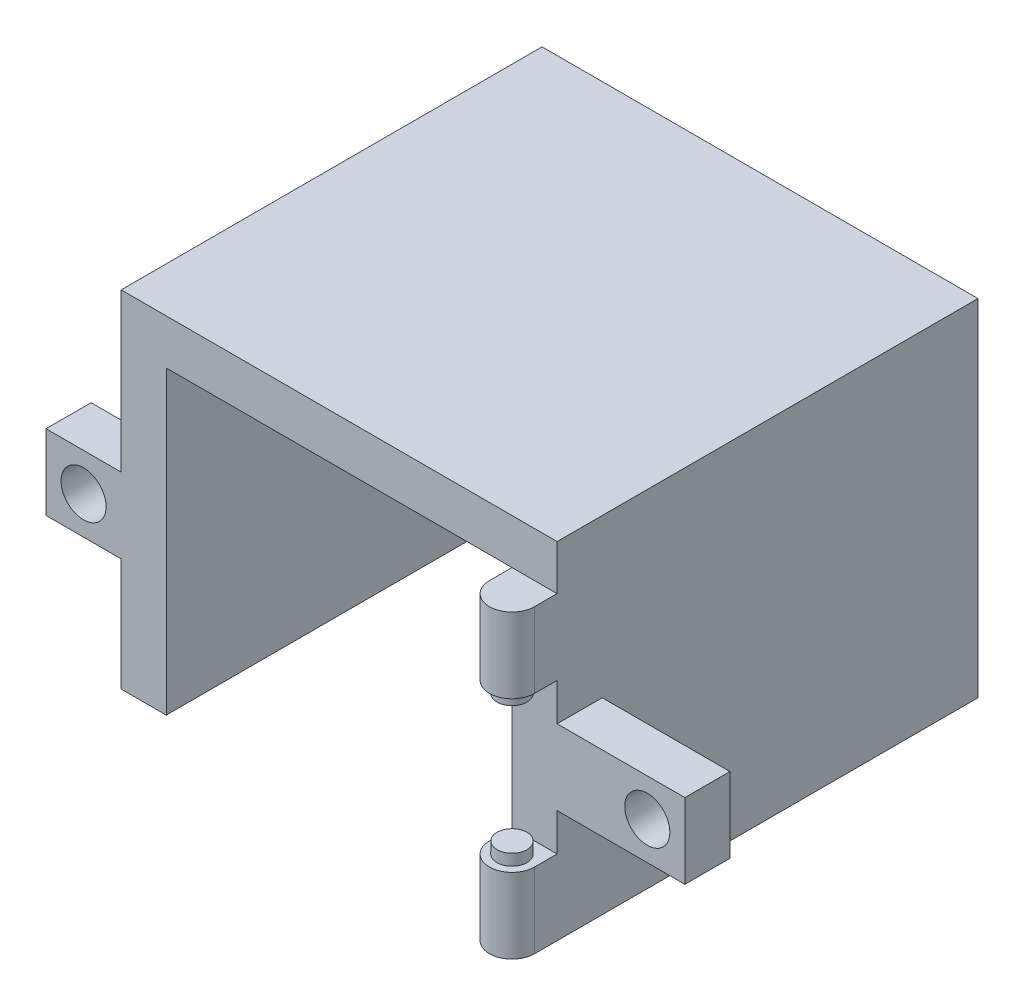
ISO-10303-21;
HEADER;
FILE_DESCRIPTION(('STEP AP214'),'2;1');
FILE_NAME('part.step','',(''),(''),'','','');
FILE_SCHEMA(('AUTOMOTIVE_DESIGN { 1 0 10303 214 1 1 1 1 }'));
ENDSEC;
DATA;
#1=APPLICATION_CONTEXT('core data for automotive mechanical design processes');
#2=APPLICATION_PROTOCOL_DEFINITION('international standard','automotive_design',2000,#1);
#3=PRODUCT_CONTEXT('',#1,'mechanical');
#4=PRODUCT('Part','Part','',(#3));
#5=PRODUCT_RELATED_PRODUCT_CATEGORY('part','',(#4));
#6=PRODUCT_DEFINITION_FORMATION('','',#4);
#7=PRODUCT_DEFINITION_CONTEXT('part definition',#1,'design');
#8=PRODUCT_DEFINITION('design','',#6,#7);
#9=PRODUCT_DEFINITION_SHAPE('','',#8);
#10=(LENGTH_UNIT() NAMED_UNIT(*) SI_UNIT(.MILLI.,.METRE.));
#11=(NAMED_UNIT(*) PLANE_ANGLE_UNIT() SI_UNIT($,.RADIAN.));
#12=(NAMED_UNIT(*) SI_UNIT($,.STERADIAN.) SOLID_ANGLE_UNIT());
#13=UNCERTAINTY_MEASURE_WITH_UNIT(LENGTH_MEASURE(1.E-05),#10,'distance_accuracy_value','');
#14=(GEOMETRIC_REPRESENTATION_CONTEXT(3) GLOBAL_UNCERTAINTY_ASSIGNED_CONTEXT((#13)) GLOBAL_UNIT_ASSIGNED_CONTEXT((#10,
#11,#12)) REPRESENTATION_CONTEXT('',''));
#15=CARTESIAN_POINT('',(0.,0.,0.));
#16=DIRECTION('',(0.,0.,1.));
#17=DIRECTION('',(1.,0.,0.));
#18=AXIS2_PLACEMENT_3D('',#15,#16,#17);
#19=CARTESIAN_POINT('',(-14.5,23.,14.));
#20=DIRECTION('',(1.,0.,0.));
#21=DIRECTION('',(0.,0.,-1.));
#22=AXIS2_PLACEMENT_3D('',#19,#20,#21);
#23=PLANE('',#22);
#24=DIRECTION('',(0.,0.,1.));
#25=VECTOR('',#24,1.);
#26=CARTESIAN_POINT('',(-14.5,7.5,11.));
#27=LINE('',#26,#25);
#28=CARTESIAN_POINT('',(-14.5,7.5,11.));
#29=VERTEX_POINT('',#28);
#30=CARTESIAN_POINT('',(-14.5,7.5,14.));
#31=VERTEX_POINT('',#30);
#32=EDGE_CURVE('E824',#29,#31,#27,.T.);
#33=ORIENTED_EDGE('',*,*,#32,.F.);
#34=DIRECTION('',(0.,1.,0.));
#35=VECTOR('',#34,1.);
#36=CARTESIAN_POINT('',(-14.5,12.5,11.));
#37=LINE('',#36,#35);
#38=CARTESIAN_POINT('',(-14.5,12.5,11.));
#39=VERTEX_POINT('',#38);
#40=EDGE_CURVE('E231',#29,#39,#37,.T.);
#41=ORIENTED_EDGE('',*,*,#40,.T.);
#42=DIRECTION('',(0.,0.,1.));
#43=VECTOR('',#42,1.);
#44=CARTESIAN_POINT('',(-14.5,12.5,11.));
#45=LINE('',#44,#43);
#46=CARTESIAN_POINT('',(-14.5,12.5,14.));
#47=VERTEX_POINT('',#46);
#48=EDGE_CURVE('E199',#39,#47,#45,.T.);
#49=ORIENTED_EDGE('',*,*,#48,.T.);
#50=DIRECTION('',(0.,-1.,0.));
#51=VECTOR('',#50,1.);
#52=CARTESIAN_POINT('',(-14.5,23.,14.));
#53=LINE('',#52,#51);
#54=CARTESIAN_POINT('',(-14.5,23.,14.));
#55=VERTEX_POINT('',#54);
#56=EDGE_CURVE('E218',#55,#47,#53,.T.);
#57=ORIENTED_EDGE('',*,*,#56,.F.);
#58=DIRECTION('',(0.,0.,1.));
#59=VECTOR('',#58,1.);
#60=CARTESIAN_POINT('',(-14.5,23.,14.));
#61=LINE('',#60,#59);
#62=CARTESIAN_POINT('',(-14.5,23.,-14.));
#63=VERTEX_POINT('',#62);
#64=EDGE_CURVE('E413',#63,#55,#61,.T.);
#65=ORIENTED_EDGE('',*,*,#64,.F.);
#66=DIRECTION('',(0.,-1.,0.));
#67=VECTOR('',#66,1.);
#68=CARTESIAN_POINT('',(-14.5,23.,-14.));
#69=LINE('',#68,#67);
#70=CARTESIAN_POINT('',(-14.5,0.,-14.));
#71=VERTEX_POINT('',#70);
#72=EDGE_CURVE('E441',#63,#71,#69,.T.);
#73=ORIENTED_EDGE('',*,*,#72,.T.);
#74=DIRECTION('',(0.,0.,1.));
#75=VECTOR('',#74,1.);
#76=CARTESIAN_POINT('',(-14.5,0.,14.));
#77=LINE('',#76,#75);
#78=CARTESIAN_POINT('',(-14.5,0.,14.));
#79=VERTEX_POINT('',#78);
#80=EDGE_CURVE('E426',#71,#79,#77,.T.);
#81=ORIENTED_EDGE('',*,*,#80,.T.);
#82=EDGE_CURVE('E437',#31,#79,#53,.T.);
#83=ORIENTED_EDGE('',*,*,#82,.F.);
#84=EDGE_LOOP('',(#33,#41,#49,#57,#65,#73,#81,#83));
#85=FACE_BOUND('',#84,.T.);
#86=ADVANCED_FACE('F45',(#85),#23,.F.);
#87=CARTESIAN_POINT('',(-14.5,23.,14.));
#88=DIRECTION('',(0.,0.,-1.));
#89=DIRECTION('',(-1.,0.,0.));
#90=AXIS2_PLACEMENT_3D('',#87,#88,#89);
#91=PLANE('',#90);
#92=DIRECTION('',(1.,0.,0.));
#93=VECTOR('',#92,1.);
#94=CARTESIAN_POINT('',(11.5,15.,14.));
#95=LINE('',#94,#93);
#96=CARTESIAN_POINT('',(11.5,15.,14.));
#97=VERTEX_POINT('',#96);
#98=CARTESIAN_POINT('',(14.5,15.,14.));
#99=VERTEX_POINT('',#98);
#100=EDGE_CURVE('E310',#97,#99,#95,.T.);
#101=ORIENTED_EDGE('',*,*,#100,.F.);
#102=DIRECTION('',(0.,1.,0.));
#103=VECTOR('',#102,1.);
#104=CARTESIAN_POINT('',(11.5,20.,14.));
#105=LINE('',#104,#103);
#106=CARTESIAN_POINT('',(11.5,5.,14.));
#107=VERTEX_POINT('',#106);
#108=EDGE_CURVE('E384',#107,#97,#105,.T.);
#109=ORIENTED_EDGE('',*,*,#108,.F.);
#110=DIRECTION('',(1.,0.,0.));
#111=VECTOR('',#110,1.);
#112=CARTESIAN_POINT('',(11.5,5.,14.));
#113=LINE('',#112,#111);
#114=CARTESIAN_POINT('',(14.5,5.,14.));
#115=VERTEX_POINT('',#114);
#116=EDGE_CURVE('E341',#107,#115,#113,.T.);
#117=ORIENTED_EDGE('',*,*,#116,.T.);
#118=DIRECTION('',(0.,-1.,0.));
#119=VECTOR('',#118,1.);
#120=CARTESIAN_POINT('',(14.5,23.,14.));
#121=LINE('',#120,#119);
#122=CARTESIAN_POINT('',(14.5,7.5,14.));
#123=VERTEX_POINT('',#122);
#124=EDGE_CURVE('E419',#123,#115,#121,.T.);
#125=ORIENTED_EDGE('',*,*,#124,.F.);
#126=DIRECTION('',(1.,0.,0.));
#127=VECTOR('',#126,1.);
#128=CARTESIAN_POINT('',(18.,7.5,14.));
#129=LINE('',#128,#127);
#130=CARTESIAN_POINT('',(23.,7.5,14.));
#131=VERTEX_POINT('',#130);
#132=EDGE_CURVE('E250',#123,#131,#129,.T.);
#133=ORIENTED_EDGE('',*,*,#132,.T.);
#134=DIRECTION('',(0.,1.,0.));
#135=VECTOR('',#134,1.);
#136=CARTESIAN_POINT('',(23.,12.5,14.));
#137=LINE('',#136,#135);
#138=CARTESIAN_POINT('',(23.,12.5,14.));
#139=VERTEX_POINT('',#138);
#140=EDGE_CURVE('E272',#131,#139,#137,.T.);
#141=ORIENTED_EDGE('',*,*,#140,.T.);
#142=DIRECTION('',(-1.,0.,0.));
#143=VECTOR('',#142,1.);
#144=CARTESIAN_POINT('',(18.,12.5,14.));
#145=LINE('',#144,#143);
#146=CARTESIAN_POINT('',(14.5,12.5,14.));
#147=VERTEX_POINT('',#146);
#148=EDGE_CURVE('E259',#139,#147,#145,.T.);
#149=ORIENTED_EDGE('',*,*,#148,.T.);
#150=EDGE_CURVE('E438',#99,#147,#121,.T.);
#151=ORIENTED_EDGE('',*,*,#150,.F.);
#152=EDGE_LOOP('',(#101,#109,#117,#125,#133,#141,#149,#151));
#153=FACE_BOUND('',#152,.T.);
#154=CARTESIAN_POINT('',(20.5,10.,14.));
#155=DIRECTION('',(0.,0.,1.));
#156=DIRECTION('',(1.,0.,0.));
#157=AXIS2_PLACEMENT_3D('',#154,#155,#156);
#158=CIRCLE('',#157,1.5);
#159=CARTESIAN_POINT('',(22.,10.,14.));
#160=VERTEX_POINT('',#159);
#161=EDGE_CURVE('E242',#160,#160,#158,.T.);
#162=ORIENTED_EDGE('',*,*,#161,.F.);
#163=EDGE_LOOP('',(#162));
#164=FACE_BOUND('',#163,.T.);
#165=ADVANCED_FACE('F492',(#153,#164),#91,.F.);
#166=CARTESIAN_POINT('',(14.5,23.,14.));
#167=DIRECTION('',(-1.,0.,0.));
#168=DIRECTION('',(0.,0.,1.));
#169=AXIS2_PLACEMENT_3D('',#166,#167,#168);
#170=PLANE('',#169);
#171=ORIENTED_EDGE('',*,*,#150,.T.);
#172=DIRECTION('',(0.,0.,1.));
#173=VECTOR('',#172,1.);
#174=CARTESIAN_POINT('',(14.5,12.5,11.));
#175=LINE('',#174,#173);
#176=CARTESIAN_POINT('',(14.5,12.5,11.));
#177=VERTEX_POINT('',#176);
#178=EDGE_CURVE('E69',#177,#147,#175,.T.);
#179=ORIENTED_EDGE('',*,*,#178,.F.);
#180=DIRECTION('',(0.,-1.,0.));
#181=VECTOR('',#180,1.);
#182=CARTESIAN_POINT('',(14.5,12.5,11.));
#183=LINE('',#182,#181);
#184=CARTESIAN_POINT('',(14.5,7.5,11.));
#185=VERTEX_POINT('',#184);
#186=EDGE_CURVE('E258',#177,#185,#183,.T.);
#187=ORIENTED_EDGE('',*,*,#186,.T.);
#188=DIRECTION('',(0.,0.,1.));
#189=VECTOR('',#188,1.);
#190=CARTESIAN_POINT('',(14.5,7.5,11.));
#191=LINE('',#190,#189);
#192=EDGE_CURVE('E286',#185,#123,#191,.T.);
#193=ORIENTED_EDGE('',*,*,#192,.T.);
#194=ORIENTED_EDGE('',*,*,#124,.T.);
#195=DIRECTION('',(0.,0.,1.));
#196=VECTOR('',#195,1.);
#197=CARTESIAN_POINT('',(14.5,5.,14.));
#198=LINE('',#197,#196);
#199=CARTESIAN_POINT('',(14.5,5.,15.5));
#200=VERTEX_POINT('',#199);
#201=EDGE_CURVE('E345',#115,#200,#198,.T.);
#202=ORIENTED_EDGE('',*,*,#201,.T.);
#203=DIRECTION('',(0.,-1.,0.));
#204=VECTOR('',#203,1.);
#205=CARTESIAN_POINT('',(14.5,5.,15.5));
#206=LINE('',#205,#204);
#207=CARTESIAN_POINT('',(14.5,0.,15.5));
#208=VERTEX_POINT('',#207);
#209=EDGE_CURVE('E353',#200,#208,#206,.T.);
#210=ORIENTED_EDGE('',*,*,#209,.T.);
#211=DIRECTION('',(0.,0.,-1.));
#212=VECTOR('',#211,1.);
#213=CARTESIAN_POINT('',(14.5,0.,14.));
#214=LINE('',#213,#212);
#215=CARTESIAN_POINT('',(14.5,0.,-14.));
#216=VERTEX_POINT('',#215);
#217=EDGE_CURVE('E394',#208,#216,#214,.T.);
#218=ORIENTED_EDGE('',*,*,#217,.T.);
#219=DIRECTION('',(0.,-1.,0.));
#220=VECTOR('',#219,1.);
#221=CARTESIAN_POINT('',(14.5,23.,-14.));
#222=LINE('',#221,#220);
#223=CARTESIAN_POINT('',(14.5,23.,-14.));
#224=VERTEX_POINT('',#223);
#225=EDGE_CURVE('E54',#224,#216,#222,.T.);
#226=ORIENTED_EDGE('',*,*,#225,.F.);
#227=DIRECTION('',(0.,0.,-1.));
#228=VECTOR('',#227,1.);
#229=CARTESIAN_POINT('',(14.5,23.,14.));
#230=LINE('',#229,#228);
#231=CARTESIAN_POINT('',(14.5,23.,14.));
#232=VERTEX_POINT('',#231);
#233=EDGE_CURVE('E405',#232,#224,#230,.T.);
#234=ORIENTED_EDGE('',*,*,#233,.F.);
#235=CARTESIAN_POINT('',(14.5,20.,14.));
#236=VERTEX_POINT('',#235);
#237=EDGE_CURVE('E433',#232,#236,#121,.T.);
#238=ORIENTED_EDGE('',*,*,#237,.T.);
#239=DIRECTION('',(0.,0.,1.));
#240=VECTOR('',#239,1.);
#241=CARTESIAN_POINT('',(14.5,20.,14.));
#242=LINE('',#241,#240);
#243=CARTESIAN_POINT('',(14.5,20.,15.5));
#244=VERTEX_POINT('',#243);
#245=EDGE_CURVE('E319',#236,#244,#242,.T.);
#246=ORIENTED_EDGE('',*,*,#245,.T.);
#247=DIRECTION('',(0.,1.,0.));
#248=VECTOR('',#247,1.);
#249=CARTESIAN_POINT('',(14.5,15.,15.5));
#250=LINE('',#249,#248);
#251=CARTESIAN_POINT('',(14.5,15.,15.5));
#252=VERTEX_POINT('',#251);
#253=EDGE_CURVE('E325',#252,#244,#250,.T.);
#254=ORIENTED_EDGE('',*,*,#253,.F.);
#255=DIRECTION('',(0.,0.,1.));
#256=VECTOR('',#255,1.);
#257=CARTESIAN_POINT('',(14.5,15.,14.));
#258=LINE('',#257,#256);
#259=EDGE_CURVE('E307',#99,#252,#258,.T.);
#260=ORIENTED_EDGE('',*,*,#259,.F.);
#261=EDGE_LOOP('',(#171,#179,#187,#193,#194,#202,#210,#218,#226,#234,#238,#246,#254,#260));
#262=FACE_BOUND('',#261,.T.);
#263=ADVANCED_FACE('F47',(#262),#170,.F.);
#264=CARTESIAN_POINT('',(-14.5,23.,-14.));
#265=DIRECTION('',(0.,0.,1.));
#266=DIRECTION('',(1.,0.,0.));
#267=AXIS2_PLACEMENT_3D('',#264,#265,#266);
#268=PLANE('',#267);
#269=DIRECTION('',(-1.,0.,0.));
#270=VECTOR('',#269,1.);
#271=CARTESIAN_POINT('',(-14.5,0.,-14.));
#272=LINE('',#271,#270);
#273=EDGE_CURVE('E423',#216,#71,#272,.T.);
#274=ORIENTED_EDGE('',*,*,#273,.T.);
#275=ORIENTED_EDGE('',*,*,#72,.F.);
#276=DIRECTION('',(-1.,0.,0.));
#277=VECTOR('',#276,1.);
#278=CARTESIAN_POINT('',(-14.5,23.,-14.));
#279=LINE('',#278,#277);
#280=EDGE_CURVE('E409',#224,#63,#279,.T.);
#281=ORIENTED_EDGE('',*,*,#280,.F.);
#282=ORIENTED_EDGE('',*,*,#225,.T.);
#283=EDGE_LOOP('',(#274,#275,#281,#282));
#284=FACE_BOUND('',#283,.T.);
#285=ADVANCED_FACE('F448',(#284),#268,.F.);
#286=DIRECTION('',(-1.,0.,0.));
#287=VECTOR('',#286,1.);
#288=CARTESIAN_POINT('',(-11.5,20.,14.));
#289=LINE('',#288,#287);
#290=CARTESIAN_POINT('',(11.5,20.,14.));
#291=VERTEX_POINT('',#290);
#292=CARTESIAN_POINT('',(-11.5,20.,14.));
#293=VERTEX_POINT('',#292);
#294=EDGE_CURVE('E369',#291,#293,#289,.T.);
#295=ORIENTED_EDGE('',*,*,#294,.F.);
#296=DIRECTION('',(1.,0.,0.));
#297=VECTOR('',#296,1.);
#298=CARTESIAN_POINT('',(11.5,20.,14.));
#299=LINE('',#298,#297);
#300=EDGE_CURVE('E304',#291,#236,#299,.T.);
#301=ORIENTED_EDGE('',*,*,#300,.T.);
#302=ORIENTED_EDGE('',*,*,#237,.F.);
#303=DIRECTION('',(1.,0.,0.));
#304=VECTOR('',#303,1.);
#305=CARTESIAN_POINT('',(-14.5,23.,14.));
#306=LINE('',#305,#304);
#307=EDGE_CURVE('E416',#55,#232,#306,.T.);
#308=ORIENTED_EDGE('',*,*,#307,.F.);
#309=ORIENTED_EDGE('',*,*,#56,.T.);
#310=DIRECTION('',(-1.,0.,0.));
#311=VECTOR('',#310,1.);
#312=CARTESIAN_POINT('',(-19.5,12.5,14.));
#313=LINE('',#312,#311);
#314=CARTESIAN_POINT('',(-19.5,12.5,14.));
#315=VERTEX_POINT('',#314);
#316=EDGE_CURVE('E61',#47,#315,#313,.T.);
#317=ORIENTED_EDGE('',*,*,#316,.T.);
#318=DIRECTION('',(0.,-1.,0.));
#319=VECTOR('',#318,1.);
#320=CARTESIAN_POINT('',(-19.5,7.5,14.));
#321=LINE('',#320,#319);
#322=CARTESIAN_POINT('',(-19.5,7.5,14.));
#323=VERTEX_POINT('',#322);
#324=EDGE_CURVE('E202',#315,#323,#321,.T.);
#325=ORIENTED_EDGE('',*,*,#324,.T.);
#326=DIRECTION('',(1.,0.,0.));
#327=VECTOR('',#326,1.);
#328=CARTESIAN_POINT('',(-14.5,7.5,14.));
#329=LINE('',#328,#327);
#330=EDGE_CURVE('E210',#323,#31,#329,.T.);
#331=ORIENTED_EDGE('',*,*,#330,.T.);
#332=ORIENTED_EDGE('',*,*,#82,.T.);
#333=DIRECTION('',(1.,0.,0.));
#334=VECTOR('',#333,1.);
#335=CARTESIAN_POINT('',(-14.5,0.,14.));
#336=LINE('',#335,#334);
#337=CARTESIAN_POINT('',(-11.5,0.,14.));
#338=VERTEX_POINT('',#337);
#339=EDGE_CURVE('E410',#79,#338,#336,.T.);
#340=ORIENTED_EDGE('',*,*,#339,.T.);
#341=DIRECTION('',(0.,-1.,0.));
#342=VECTOR('',#341,1.);
#343=CARTESIAN_POINT('',(-11.5,20.,14.));
#344=LINE('',#343,#342);
#345=EDGE_CURVE('E361',#293,#338,#344,.T.);
#346=ORIENTED_EDGE('',*,*,#345,.F.);
#347=EDGE_LOOP('',(#295,#301,#302,#308,#309,#317,#325,#331,#332,#340,#346));
#348=FACE_BOUND('',#347,.T.);
#349=CARTESIAN_POINT('',(-17.,10.,14.));
#350=DIRECTION('',(0.,0.,1.));
#351=DIRECTION('',(1.,0.,0.));
#352=AXIS2_PLACEMENT_3D('',#349,#350,#351);
#353=CIRCLE('',#352,1.5);
#354=CARTESIAN_POINT('',(-15.5,10.,14.));
#355=VERTEX_POINT('',#354);
#356=EDGE_CURVE('E238',#355,#355,#353,.T.);
#357=ORIENTED_EDGE('',*,*,#356,.F.);
#358=EDGE_LOOP('',(#357));
#359=FACE_BOUND('',#358,.T.);
#360=ADVANCED_FACE('F214',(#348,#359),#91,.F.);
#361=CARTESIAN_POINT('',(0.,23.,0.));
#362=DIRECTION('',(0.,-1.,0.));
#363=DIRECTION('',(0.,0.,-1.));
#364=AXIS2_PLACEMENT_3D('',#361,#362,#363);
#365=PLANE('',#364);
#366=ORIENTED_EDGE('',*,*,#233,.T.);
#367=ORIENTED_EDGE('',*,*,#280,.T.);
#368=ORIENTED_EDGE('',*,*,#64,.T.);
#369=ORIENTED_EDGE('',*,*,#307,.T.);
#370=EDGE_LOOP('',(#366,#367,#368,#369));
#371=FACE_BOUND('',#370,.T.);
#372=ADVANCED_FACE('F462',(#371),#365,.F.);
#373=CARTESIAN_POINT('',(0.,0.,0.));
#374=DIRECTION('',(0.,-1.,0.));
#375=DIRECTION('',(0.,0.,-1.));
#376=AXIS2_PLACEMENT_3D('',#373,#374,#375);
#377=PLANE('',#376);
#378=DIRECTION('',(0.,0.,1.));
#379=VECTOR('',#378,1.);
#380=CARTESIAN_POINT('',(-11.5,0.,-11.));
#381=LINE('',#380,#379);
#382=CARTESIAN_POINT('',(-11.5,0.,-11.));
#383=VERTEX_POINT('',#382);
#384=EDGE_CURVE('E381',#383,#338,#381,.T.);
#385=ORIENTED_EDGE('',*,*,#384,.T.);
#386=ORIENTED_EDGE('',*,*,#339,.F.);
#387=ORIENTED_EDGE('',*,*,#80,.F.);
#388=ORIENTED_EDGE('',*,*,#273,.F.);
#389=ORIENTED_EDGE('',*,*,#217,.F.);
#390=CARTESIAN_POINT('',(13.,0.,15.5));
#391=DIRECTION('',(0.,-1.,0.));
#392=DIRECTION('',(0.,0.,-1.));
#393=AXIS2_PLACEMENT_3D('',#390,#391,#392);
#394=CIRCLE('',#393,1.5);
#395=CARTESIAN_POINT('',(11.5,0.,15.5));
#396=VERTEX_POINT('',#395);
#397=EDGE_CURVE('E336',#208,#396,#394,.T.);
#398=ORIENTED_EDGE('',*,*,#397,.T.);
#399=DIRECTION('',(0.,0.,1.));
#400=VECTOR('',#399,1.);
#401=CARTESIAN_POINT('',(11.5,0.,-11.));
#402=LINE('',#401,#400);
#403=CARTESIAN_POINT('',(11.5,0.,-11.));
#404=VERTEX_POINT('',#403);
#405=EDGE_CURVE('E399',#404,#396,#402,.T.);
#406=ORIENTED_EDGE('',*,*,#405,.F.);
#407=DIRECTION('',(1.,0.,0.));
#408=VECTOR('',#407,1.);
#409=CARTESIAN_POINT('',(-11.5,0.,-11.));
#410=LINE('',#409,#408);
#411=EDGE_CURVE('E368',#383,#404,#410,.T.);
#412=ORIENTED_EDGE('',*,*,#411,.F.);
#413=EDGE_LOOP('',(#385,#386,#387,#388,#389,#398,#406,#412));
#414=FACE_BOUND('',#413,.T.);
#415=ADVANCED_FACE('F453',(#414),#377,.T.);
#416=CARTESIAN_POINT('',(-11.5,20.,-11.));
#417=DIRECTION('',(-1.,0.,0.));
#418=DIRECTION('',(0.,0.,1.));
#419=AXIS2_PLACEMENT_3D('',#416,#417,#418);
#420=PLANE('',#419);
#421=ORIENTED_EDGE('',*,*,#345,.T.);
#422=ORIENTED_EDGE('',*,*,#384,.F.);
#423=DIRECTION('',(0.,-1.,0.));
#424=VECTOR('',#423,1.);
#425=CARTESIAN_POINT('',(-11.5,20.,-11.));
#426=LINE('',#425,#424);
#427=CARTESIAN_POINT('',(-11.5,20.,-11.));
#428=VERTEX_POINT('',#427);
#429=EDGE_CURVE('E365',#428,#383,#426,.T.);
#430=ORIENTED_EDGE('',*,*,#429,.F.);
#431=DIRECTION('',(0.,0.,1.));
#432=VECTOR('',#431,1.);
#433=CARTESIAN_POINT('',(-11.5,20.,-11.));
#434=LINE('',#433,#432);
#435=EDGE_CURVE('E391',#428,#293,#434,.T.);
#436=ORIENTED_EDGE('',*,*,#435,.T.);
#437=EDGE_LOOP('',(#421,#422,#430,#436));
#438=FACE_BOUND('',#437,.T.);
#439=ADVANCED_FACE('F604',(#438),#420,.F.);
#440=CARTESIAN_POINT('',(-11.5,20.,-11.));
#441=DIRECTION('',(0.,1.,0.));
#442=DIRECTION('',(0.,0.,1.));
#443=AXIS2_PLACEMENT_3D('',#440,#441,#442);
#444=PLANE('',#443);
#445=ORIENTED_EDGE('',*,*,#294,.T.);
#446=ORIENTED_EDGE('',*,*,#435,.F.);
#447=DIRECTION('',(-1.,0.,0.));
#448=VECTOR('',#447,1.);
#449=CARTESIAN_POINT('',(-11.5,20.,-11.));
#450=LINE('',#449,#448);
#451=CARTESIAN_POINT('',(11.5,20.,-11.));
#452=VERTEX_POINT('',#451);
#453=EDGE_CURVE('E377',#452,#428,#450,.T.);
#454=ORIENTED_EDGE('',*,*,#453,.F.);
#455=DIRECTION('',(0.,0.,1.));
#456=VECTOR('',#455,1.);
#457=CARTESIAN_POINT('',(11.5,20.,-11.));
#458=LINE('',#457,#456);
#459=EDGE_CURVE('E395',#452,#291,#458,.T.);
#460=ORIENTED_EDGE('',*,*,#459,.T.);
#461=EDGE_LOOP('',(#445,#446,#454,#460));
#462=FACE_BOUND('',#461,.T.);
#463=ADVANCED_FACE('F473',(#462),#444,.F.);
#464=CARTESIAN_POINT('',(11.5,20.,-11.));
#465=DIRECTION('',(1.,0.,0.));
#466=DIRECTION('',(0.,1.,0.));
#467=AXIS2_PLACEMENT_3D('',#464,#465,#466);
#468=PLANE('',#467);
#469=ORIENTED_EDGE('',*,*,#405,.T.);
#470=DIRECTION('',(0.,-1.,0.));
#471=VECTOR('',#470,1.);
#472=CARTESIAN_POINT('',(11.5,5.,15.5));
#473=LINE('',#472,#471);
#474=CARTESIAN_POINT('',(11.5,5.,15.5));
#475=VERTEX_POINT('',#474);
#476=EDGE_CURVE('E357',#475,#396,#473,.T.);
#477=ORIENTED_EDGE('',*,*,#476,.F.);
#478=DIRECTION('',(0.,0.,-1.));
#479=VECTOR('',#478,1.);
#480=CARTESIAN_POINT('',(11.5,5.,14.));
#481=LINE('',#480,#479);
#482=EDGE_CURVE('E337',#475,#107,#481,.T.);
#483=ORIENTED_EDGE('',*,*,#482,.T.);
#484=ORIENTED_EDGE('',*,*,#108,.T.);
#485=DIRECTION('',(0.,0.,-1.));
#486=VECTOR('',#485,1.);
#487=CARTESIAN_POINT('',(11.5,15.,14.));
#488=LINE('',#487,#486);
#489=CARTESIAN_POINT('',(11.5,15.,15.5));
#490=VERTEX_POINT('',#489);
#491=EDGE_CURVE('E300',#490,#97,#488,.T.);
#492=ORIENTED_EDGE('',*,*,#491,.F.);
#493=DIRECTION('',(0.,1.,0.));
#494=VECTOR('',#493,1.);
#495=CARTESIAN_POINT('',(11.5,15.,15.5));
#496=LINE('',#495,#494);
#497=CARTESIAN_POINT('',(11.5,20.,15.5));
#498=VERTEX_POINT('',#497);
#499=EDGE_CURVE('E313',#490,#498,#496,.T.);
#500=ORIENTED_EDGE('',*,*,#499,.T.);
#501=DIRECTION('',(0.,0.,-1.));
#502=VECTOR('',#501,1.);
#503=CARTESIAN_POINT('',(11.5,20.,14.));
#504=LINE('',#503,#502);
#505=EDGE_CURVE('E296',#498,#291,#504,.T.);
#506=ORIENTED_EDGE('',*,*,#505,.T.);
#507=ORIENTED_EDGE('',*,*,#459,.F.);
#508=DIRECTION('',(0.,1.,0.));
#509=VECTOR('',#508,1.);
#510=CARTESIAN_POINT('',(11.5,20.,-11.));
#511=LINE('',#510,#509);
#512=EDGE_CURVE('E373',#404,#452,#511,.T.);
#513=ORIENTED_EDGE('',*,*,#512,.F.);
#514=EDGE_LOOP('',(#469,#477,#483,#484,#492,#500,#506,#507,#513));
#515=FACE_BOUND('',#514,.T.);
#516=ADVANCED_FACE('F475',(#515),#468,.F.);
#517=CARTESIAN_POINT('',(0.,0.,-11.));
#518=DIRECTION('',(0.,0.,1.));
#519=DIRECTION('',(1.,0.,0.));
#520=AXIS2_PLACEMENT_3D('',#517,#518,#519);
#521=PLANE('',#520);
#522=ORIENTED_EDGE('',*,*,#429,.T.);
#523=ORIENTED_EDGE('',*,*,#411,.T.);
#524=ORIENTED_EDGE('',*,*,#512,.T.);
#525=ORIENTED_EDGE('',*,*,#453,.T.);
#526=EDGE_LOOP('',(#522,#523,#524,#525));
#527=FACE_BOUND('',#526,.T.);
#528=ADVANCED_FACE('F477',(#527),#521,.T.);
#529=CARTESIAN_POINT('',(13.,5.,15.5));
#530=DIRECTION('',(0.,-1.,0.));
#531=DIRECTION('',(0.,0.,-1.));
#532=AXIS2_PLACEMENT_3D('',#529,#530,#531);
#533=CYLINDRICAL_SURFACE('',#532,1.5);
#534=ORIENTED_EDGE('',*,*,#397,.F.);
#535=ORIENTED_EDGE('',*,*,#209,.F.);
#536=CARTESIAN_POINT('',(13.,5.,15.5));
#537=DIRECTION('',(0.,-1.,0.));
#538=DIRECTION('',(0.,0.,-1.));
#539=AXIS2_PLACEMENT_3D('',#536,#537,#538);
#540=CIRCLE('',#539,1.5);
#541=EDGE_CURVE('E349',#200,#475,#540,.T.);
#542=ORIENTED_EDGE('',*,*,#541,.T.);
#543=ORIENTED_EDGE('',*,*,#476,.T.);
#544=EDGE_LOOP('',(#534,#535,#542,#543));
#545=FACE_BOUND('',#544,.T.);
#546=ADVANCED_FACE('F483',(#545),#533,.T.);
#547=CARTESIAN_POINT('',(13.,5.,15.5));
#548=DIRECTION('',(0.,-1.,0.));
#549=DIRECTION('',(0.,0.,-1.));
#550=AXIS2_PLACEMENT_3D('',#547,#548,#549);
#551=PLANE('',#550);
#552=CARTESIAN_POINT('',(13.,5.,15.5));
#553=DIRECTION('',(0.,-1.,0.));
#554=DIRECTION('',(0.,0.,-1.));
#555=AXIS2_PLACEMENT_3D('',#552,#553,#554);
#556=CIRCLE('',#555,0.999999999999999);
#557=CARTESIAN_POINT('',(13.,5.,14.5));
#558=VERTEX_POINT('',#557);
#559=EDGE_CURVE('E11',#558,#558,#556,.F.);
#560=ORIENTED_EDGE('',*,*,#559,.F.);
#561=EDGE_LOOP('',(#560));
#562=FACE_BOUND('',#561,.T.);
#563=ORIENTED_EDGE('',*,*,#482,.F.);
#564=ORIENTED_EDGE('',*,*,#541,.F.);
#565=ORIENTED_EDGE('',*,*,#201,.F.);
#566=ORIENTED_EDGE('',*,*,#116,.F.);
#567=EDGE_LOOP('',(#563,#564,#565,#566));
#568=FACE_BOUND('',#567,.T.);
#569=ADVANCED_FACE('F487',(#562,#568),#551,.F.);
#570=CARTESIAN_POINT('',(13.,5.75,15.5));
#571=DIRECTION('',(0.,-1.,0.));
#572=DIRECTION('',(0.,0.,-1.));
#573=AXIS2_PLACEMENT_3D('',#570,#571,#572);
#574=CYLINDRICAL_SURFACE('',#573,0.999999999999999);
#575=CARTESIAN_POINT('',(13.,5.75,15.5));
#576=DIRECTION('',(0.,1.,0.));
#577=DIRECTION('',(0.,0.,1.));
#578=AXIS2_PLACEMENT_3D('',#575,#576,#577);
#579=CIRCLE('',#578,0.999999999999999);
#580=CARTESIAN_POINT('',(13.,5.75,16.5));
#581=VERTEX_POINT('',#580);
#582=EDGE_CURVE('E329',#581,#581,#579,.T.);
#583=ORIENTED_EDGE('',*,*,#582,.F.);
#584=EDGE_LOOP('',(#583));
#585=FACE_BOUND('',#584,.T.);
#586=ORIENTED_EDGE('',*,*,#559,.T.);
#587=EDGE_LOOP('',(#586));
#588=FACE_BOUND('',#587,.T.);
#589=ADVANCED_FACE('F511',(#585,#588),#574,.T.);
#590=CARTESIAN_POINT('',(13.,5.75,15.5));
#591=DIRECTION('',(0.,1.,0.));
#592=DIRECTION('',(0.,0.,1.));
#593=AXIS2_PLACEMENT_3D('',#590,#591,#592);
#594=PLANE('',#593);
#595=ORIENTED_EDGE('',*,*,#582,.T.);
#596=EDGE_LOOP('',(#595));
#597=FACE_BOUND('',#596,.T.);
#598=ADVANCED_FACE('F503',(#597),#594,.T.);
#599=CARTESIAN_POINT('',(13.,15.,15.5));
#600=DIRECTION('',(0.,1.,0.));
#601=DIRECTION('',(0.,0.,1.));
#602=AXIS2_PLACEMENT_3D('',#599,#600,#601);
#603=CYLINDRICAL_SURFACE('',#602,1.5);
#604=CARTESIAN_POINT('',(13.,20.,15.5));
#605=DIRECTION('',(0.,-1.,0.));
#606=DIRECTION('',(0.,0.,-1.));
#607=AXIS2_PLACEMENT_3D('',#604,#605,#606);
#608=CIRCLE('',#607,1.5);
#609=EDGE_CURVE('E316',#244,#498,#608,.T.);
#610=ORIENTED_EDGE('',*,*,#609,.T.);
#611=ORIENTED_EDGE('',*,*,#499,.F.);
#612=CARTESIAN_POINT('',(13.,15.,15.5));
#613=DIRECTION('',(0.,-1.,0.));
#614=DIRECTION('',(0.,0.,-1.));
#615=AXIS2_PLACEMENT_3D('',#612,#613,#614);
#616=CIRCLE('',#615,1.5);
#617=EDGE_CURVE('E303',#252,#490,#616,.T.);
#618=ORIENTED_EDGE('',*,*,#617,.F.);
#619=ORIENTED_EDGE('',*,*,#253,.T.);
#620=EDGE_LOOP('',(#610,#611,#618,#619));
#621=FACE_BOUND('',#620,.T.);
#622=ADVANCED_FACE('F501',(#621),#603,.T.);
#623=CARTESIAN_POINT('',(13.,15.,15.5));
#624=DIRECTION('',(0.,1.,0.));
#625=DIRECTION('',(0.,0.,-1.));
#626=AXIS2_PLACEMENT_3D('',#623,#624,#625);
#627=PLANE('',#626);
#628=CARTESIAN_POINT('',(13.,15.,15.5));
#629=DIRECTION('',(0.,1.,0.));
#630=DIRECTION('',(0.,0.,1.));
#631=AXIS2_PLACEMENT_3D('',#628,#629,#630);
#632=CIRCLE('',#631,0.999999999999999);
#633=CARTESIAN_POINT('',(13.,15.,16.5));
#634=VERTEX_POINT('',#633);
#635=EDGE_CURVE('E282',#634,#634,#632,.T.);
#636=ORIENTED_EDGE('',*,*,#635,.T.);
#637=EDGE_LOOP('',(#636));
#638=FACE_BOUND('',#637,.T.);
#639=ORIENTED_EDGE('',*,*,#491,.T.);
#640=ORIENTED_EDGE('',*,*,#100,.T.);
#641=ORIENTED_EDGE('',*,*,#259,.T.);
#642=ORIENTED_EDGE('',*,*,#617,.T.);
#643=EDGE_LOOP('',(#639,#640,#641,#642));
#644=FACE_BOUND('',#643,.T.);
#645=ADVANCED_FACE('F497',(#638,#644),#627,.F.);
#646=CARTESIAN_POINT('',(13.,20.,15.5));
#647=DIRECTION('',(0.,1.,0.));
#648=DIRECTION('',(0.,0.,-1.));
#649=AXIS2_PLACEMENT_3D('',#646,#647,#648);
#650=PLANE('',#649);
#651=ORIENTED_EDGE('',*,*,#505,.F.);
#652=ORIENTED_EDGE('',*,*,#609,.F.);
#653=ORIENTED_EDGE('',*,*,#245,.F.);
#654=ORIENTED_EDGE('',*,*,#300,.F.);
#655=EDGE_LOOP('',(#651,#652,#653,#654));
#656=FACE_BOUND('',#655,.T.);
#657=ADVANCED_FACE('F469',(#656),#650,.T.);
#658=CARTESIAN_POINT('',(13.,14.25,15.5));
#659=DIRECTION('',(0.,1.,0.));
#660=DIRECTION('',(0.,0.,1.));
#661=AXIS2_PLACEMENT_3D('',#658,#659,#660);
#662=CYLINDRICAL_SURFACE('',#661,0.999999999999999);
#663=CARTESIAN_POINT('',(13.,14.25,15.5));
#664=DIRECTION('',(0.,1.,0.));
#665=DIRECTION('',(0.,0.,1.));
#666=AXIS2_PLACEMENT_3D('',#663,#664,#665);
#667=CIRCLE('',#666,0.999999999999999);
#668=CARTESIAN_POINT('',(13.,14.25,16.5));
#669=VERTEX_POINT('',#668);
#670=EDGE_CURVE('E292',#669,#669,#667,.T.);
#671=ORIENTED_EDGE('',*,*,#670,.T.);
#672=EDGE_LOOP('',(#671));
#673=FACE_BOUND('',#672,.T.);
#674=ORIENTED_EDGE('',*,*,#635,.F.);
#675=EDGE_LOOP('',(#674));
#676=FACE_BOUND('',#675,.T.);
#677=ADVANCED_FACE('F553',(#673,#676),#662,.T.);
#678=CARTESIAN_POINT('',(13.,14.25,15.5));
#679=DIRECTION('',(0.,-1.,0.));
#680=DIRECTION('',(0.,0.,1.));
#681=AXIS2_PLACEMENT_3D('',#678,#679,#680);
#682=PLANE('',#681);
#683=ORIENTED_EDGE('',*,*,#670,.F.);
#684=EDGE_LOOP('',(#683));
#685=FACE_BOUND('',#684,.T.);
#686=ADVANCED_FACE('F547',(#685),#682,.T.);
#687=CARTESIAN_POINT('',(18.,12.5,11.));
#688=DIRECTION('',(0.,1.,0.));
#689=DIRECTION('',(0.,0.,1.));
#690=AXIS2_PLACEMENT_3D('',#687,#688,#689);
#691=PLANE('',#690);
#692=ORIENTED_EDGE('',*,*,#148,.F.);
#693=DIRECTION('',(0.,0.,1.));
#694=VECTOR('',#693,1.);
#695=CARTESIAN_POINT('',(23.,12.5,11.));
#696=LINE('',#695,#694);
#697=CARTESIAN_POINT('',(23.,12.5,11.));
#698=VERTEX_POINT('',#697);
#699=EDGE_CURVE('E279',#698,#139,#696,.T.);
#700=ORIENTED_EDGE('',*,*,#699,.F.);
#701=DIRECTION('',(-1.,0.,0.));
#702=VECTOR('',#701,1.);
#703=CARTESIAN_POINT('',(18.,12.5,11.));
#704=LINE('',#703,#702);
#705=EDGE_CURVE('E254',#698,#177,#704,.T.);
#706=ORIENTED_EDGE('',*,*,#705,.T.);
#707=ORIENTED_EDGE('',*,*,#178,.T.);
#708=EDGE_LOOP('',(#692,#700,#706,#707));
#709=FACE_BOUND('',#708,.T.);
#710=ADVANCED_FACE('F552',(#709),#691,.T.);
#711=CARTESIAN_POINT('',(23.,12.5,11.));
#712=DIRECTION('',(1.,0.,0.));
#713=DIRECTION('',(0.,0.,-1.));
#714=AXIS2_PLACEMENT_3D('',#711,#712,#713);
#715=PLANE('',#714);
#716=ORIENTED_EDGE('',*,*,#140,.F.);
#717=DIRECTION('',(0.,0.,1.));
#718=VECTOR('',#717,1.);
#719=CARTESIAN_POINT('',(23.,7.5,11.));
#720=LINE('',#719,#718);
#721=CARTESIAN_POINT('',(23.,7.5,11.));
#722=VERTEX_POINT('',#721);
#723=EDGE_CURVE('E283',#722,#131,#720,.T.);
#724=ORIENTED_EDGE('',*,*,#723,.F.);
#725=DIRECTION('',(0.,1.,0.));
#726=VECTOR('',#725,1.);
#727=CARTESIAN_POINT('',(23.,12.5,11.));
#728=LINE('',#727,#726);
#729=EDGE_CURVE('E265',#722,#698,#728,.T.);
#730=ORIENTED_EDGE('',*,*,#729,.T.);
#731=ORIENTED_EDGE('',*,*,#699,.T.);
#732=EDGE_LOOP('',(#716,#724,#730,#731));
#733=FACE_BOUND('',#732,.T.);
#734=ADVANCED_FACE('F705',(#733),#715,.T.);
#735=CARTESIAN_POINT('',(18.,7.5,11.));
#736=DIRECTION('',(0.,-1.,0.));
#737=DIRECTION('',(0.,0.,-1.));
#738=AXIS2_PLACEMENT_3D('',#735,#736,#737);
#739=PLANE('',#738);
#740=ORIENTED_EDGE('',*,*,#132,.F.);
#741=ORIENTED_EDGE('',*,*,#192,.F.);
#742=DIRECTION('',(1.,0.,0.));
#743=VECTOR('',#742,1.);
#744=CARTESIAN_POINT('',(18.,7.5,11.));
#745=LINE('',#744,#743);
#746=EDGE_CURVE('E262',#185,#722,#745,.T.);
#747=ORIENTED_EDGE('',*,*,#746,.T.);
#748=ORIENTED_EDGE('',*,*,#723,.T.);
#749=EDGE_LOOP('',(#740,#741,#747,#748));
#750=FACE_BOUND('',#749,.T.);
#751=ADVANCED_FACE('F719',(#750),#739,.T.);
#752=CARTESIAN_POINT('',(0.,0.,11.));
#753=DIRECTION('',(0.,0.,1.));
#754=DIRECTION('',(1.,0.,0.));
#755=AXIS2_PLACEMENT_3D('',#752,#753,#754);
#756=PLANE('',#755);
#757=CARTESIAN_POINT('',(20.5,10.,11.));
#758=DIRECTION('',(0.,0.,1.));
#759=DIRECTION('',(1.,0.,0.));
#760=AXIS2_PLACEMENT_3D('',#757,#758,#759);
#761=CIRCLE('',#760,1.5);
#762=CARTESIAN_POINT('',(22.,10.,11.));
#763=VERTEX_POINT('',#762);
#764=EDGE_CURVE('E246',#763,#763,#761,.T.);
#765=ORIENTED_EDGE('',*,*,#764,.T.);
#766=EDGE_LOOP('',(#765));
#767=FACE_BOUND('',#766,.T.);
#768=ORIENTED_EDGE('',*,*,#705,.F.);
#769=ORIENTED_EDGE('',*,*,#729,.F.);
#770=ORIENTED_EDGE('',*,*,#746,.F.);
#771=ORIENTED_EDGE('',*,*,#186,.F.);
#772=EDGE_LOOP('',(#768,#769,#770,#771));
#773=FACE_BOUND('',#772,.T.);
#774=ADVANCED_FACE('F730',(#767,#773),#756,.F.);
#775=CARTESIAN_POINT('',(20.5,10.,11.));
#776=DIRECTION('',(0.,0.,1.));
#777=DIRECTION('',(1.,0.,0.));
#778=AXIS2_PLACEMENT_3D('',#775,#776,#777);
#779=CYLINDRICAL_SURFACE('',#778,1.5);
#780=ORIENTED_EDGE('',*,*,#764,.F.);
#781=EDGE_LOOP('',(#780));
#782=FACE_BOUND('',#781,.T.);
#783=ORIENTED_EDGE('',*,*,#161,.T.);
#784=EDGE_LOOP('',(#783));
#785=FACE_BOUND('',#784,.T.);
#786=ADVANCED_FACE('F744',(#782,#785),#779,.F.);
#787=CARTESIAN_POINT('',(-19.5,7.5,11.));
#788=DIRECTION('',(-1.,0.,0.));
#789=DIRECTION('',(0.,0.,1.));
#790=AXIS2_PLACEMENT_3D('',#787,#788,#789);
#791=PLANE('',#790);
#792=ORIENTED_EDGE('',*,*,#324,.F.);
#793=DIRECTION('',(0.,0.,1.));
#794=VECTOR('',#793,1.);
#795=CARTESIAN_POINT('',(-19.5,12.5,11.));
#796=LINE('',#795,#794);
#797=CARTESIAN_POINT('',(-19.5,12.5,11.));
#798=VERTEX_POINT('',#797);
#799=EDGE_CURVE('E190',#798,#315,#796,.T.);
#800=ORIENTED_EDGE('',*,*,#799,.F.);
#801=DIRECTION('',(0.,-1.,0.));
#802=VECTOR('',#801,1.);
#803=CARTESIAN_POINT('',(-19.5,7.5,11.));
#804=LINE('',#803,#802);
#805=CARTESIAN_POINT('',(-19.5,7.5,11.));
#806=VERTEX_POINT('',#805);
#807=EDGE_CURVE('E220',#798,#806,#804,.T.);
#808=ORIENTED_EDGE('',*,*,#807,.T.);
#809=DIRECTION('',(0.,0.,1.));
#810=VECTOR('',#809,1.);
#811=CARTESIAN_POINT('',(-19.5,7.5,11.));
#812=LINE('',#811,#810);
#813=EDGE_CURVE('E204',#806,#323,#812,.T.);
#814=ORIENTED_EDGE('',*,*,#813,.T.);
#815=EDGE_LOOP('',(#792,#800,#808,#814));
#816=FACE_BOUND('',#815,.T.);
#817=ADVANCED_FACE('F203',(#816),#791,.T.);
#818=CARTESIAN_POINT('',(-19.5,12.5,11.));
#819=DIRECTION('',(0.,1.,0.));
#820=DIRECTION('',(0.,0.,1.));
#821=AXIS2_PLACEMENT_3D('',#818,#819,#820);
#822=PLANE('',#821);
#823=ORIENTED_EDGE('',*,*,#316,.F.);
#824=ORIENTED_EDGE('',*,*,#48,.F.);
#825=DIRECTION('',(-1.,0.,0.));
#826=VECTOR('',#825,1.);
#827=CARTESIAN_POINT('',(-19.5,12.5,11.));
#828=LINE('',#827,#826);
#829=EDGE_CURVE('E194',#39,#798,#828,.T.);
#830=ORIENTED_EDGE('',*,*,#829,.T.);
#831=ORIENTED_EDGE('',*,*,#799,.T.);
#832=EDGE_LOOP('',(#823,#824,#830,#831));
#833=FACE_BOUND('',#832,.T.);
#834=ADVANCED_FACE('F192',(#833),#822,.T.);
#835=CARTESIAN_POINT('',(-14.5,7.5,11.));
#836=DIRECTION('',(0.,-1.,0.));
#837=DIRECTION('',(0.,0.,-1.));
#838=AXIS2_PLACEMENT_3D('',#835,#836,#837);
#839=PLANE('',#838);
#840=ORIENTED_EDGE('',*,*,#330,.F.);
#841=ORIENTED_EDGE('',*,*,#813,.F.);
#842=DIRECTION('',(1.,0.,0.));
#843=VECTOR('',#842,1.);
#844=CARTESIAN_POINT('',(-14.5,7.5,11.));
#845=LINE('',#844,#843);
#846=EDGE_CURVE('E225',#806,#29,#845,.T.);
#847=ORIENTED_EDGE('',*,*,#846,.T.);
#848=ORIENTED_EDGE('',*,*,#32,.T.);
#849=EDGE_LOOP('',(#840,#841,#847,#848));
#850=FACE_BOUND('',#849,.T.);
#851=ADVANCED_FACE('F774',(#850),#839,.T.);
#852=CARTESIAN_POINT('',(0.,0.,11.));
#853=DIRECTION('',(0.,0.,-1.));
#854=DIRECTION('',(-1.,0.,0.));
#855=AXIS2_PLACEMENT_3D('',#852,#853,#854);
#856=PLANE('',#855);
#857=CARTESIAN_POINT('',(-17.,10.,11.));
#858=DIRECTION('',(0.,0.,1.));
#859=DIRECTION('',(1.,0.,0.));
#860=AXIS2_PLACEMENT_3D('',#857,#858,#859);
#861=CIRCLE('',#860,1.5);
#862=CARTESIAN_POINT('',(-15.5,10.,11.));
#863=VERTEX_POINT('',#862);
#864=EDGE_CURVE('E209',#863,#863,#861,.T.);
#865=ORIENTED_EDGE('',*,*,#864,.T.);
#866=EDGE_LOOP('',(#865));
#867=FACE_BOUND('',#866,.T.);
#868=ORIENTED_EDGE('',*,*,#807,.F.);
#869=ORIENTED_EDGE('',*,*,#829,.F.);
#870=ORIENTED_EDGE('',*,*,#40,.F.);
#871=ORIENTED_EDGE('',*,*,#846,.F.);
#872=EDGE_LOOP('',(#868,#869,#870,#871));
#873=FACE_BOUND('',#872,.T.);
#874=ADVANCED_FACE('F784',(#867,#873),#856,.T.);
#875=CARTESIAN_POINT('',(-17.,10.,11.));
#876=DIRECTION('',(0.,0.,1.));
#877=DIRECTION('',(1.,0.,0.));
#878=AXIS2_PLACEMENT_3D('',#875,#876,#877);
#879=CYLINDRICAL_SURFACE('',#878,1.5);
#880=ORIENTED_EDGE('',*,*,#864,.F.);
#881=EDGE_LOOP('',(#880));
#882=FACE_BOUND('',#881,.T.);
#883=ORIENTED_EDGE('',*,*,#356,.T.);
#884=EDGE_LOOP('',(#883));
#885=FACE_BOUND('',#884,.T.);
#886=ADVANCED_FACE('F795',(#882,#885),#879,.F.);
#887=CLOSED_SHELL('',(#86,#165,#263,#285,#360,#372,#415,#439,#463,#516,#528,#546,#569,#589,#598,
#622,#645,#657,#677,#686,#710,#734,#751,#774,#786,#817,#834,#851,#874,#886));
#888=MANIFOLD_SOLID_BREP('B2',#887);
#889=ADVANCED_BREP_SHAPE_REPRESENTATION('',(#18,#888),#14);
#890=SHAPE_DEFINITION_REPRESENTATION(#9,#889);
ENDSEC;
END-ISO-10303-21;
